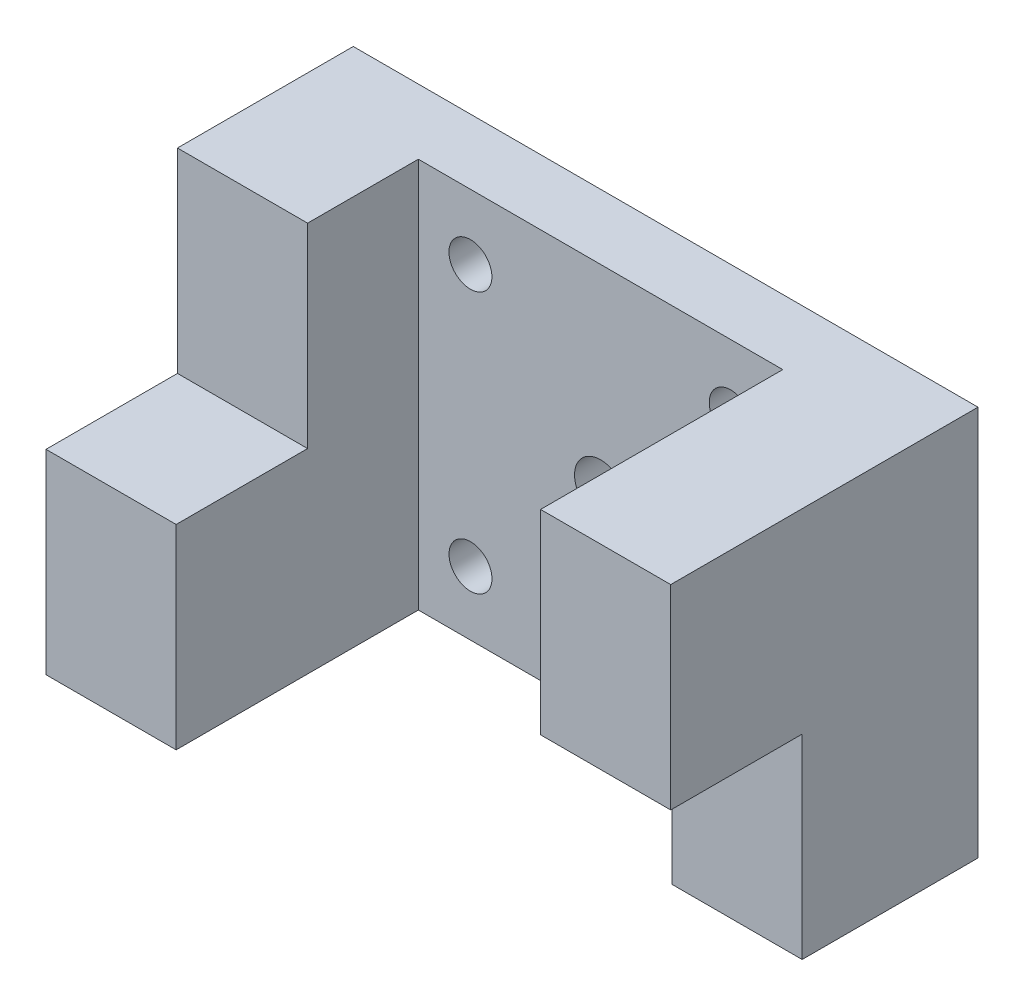
ISO-10303-21;
HEADER;
FILE_DESCRIPTION(('STEP AP214'),'2;1');
FILE_NAME('part.step','',(''),(''),'','','');
FILE_SCHEMA(('AUTOMOTIVE_DESIGN { 1 0 10303 214 1 1 1 1 }'));
ENDSEC;
DATA;
#1=APPLICATION_CONTEXT('core data for automotive mechanical design processes');
#2=APPLICATION_PROTOCOL_DEFINITION('international standard','automotive_design',2000,#1);
#3=PRODUCT_CONTEXT('',#1,'mechanical');
#4=PRODUCT('Part','Part','',(#3));
#5=PRODUCT_RELATED_PRODUCT_CATEGORY('part','',(#4));
#6=PRODUCT_DEFINITION_FORMATION('','',#4);
#7=PRODUCT_DEFINITION_CONTEXT('part definition',#1,'design');
#8=PRODUCT_DEFINITION('design','',#6,#7);
#9=PRODUCT_DEFINITION_SHAPE('','',#8);
#10=(LENGTH_UNIT() NAMED_UNIT(*) SI_UNIT(.MILLI.,.METRE.));
#11=(NAMED_UNIT(*) PLANE_ANGLE_UNIT() SI_UNIT($,.RADIAN.));
#12=(NAMED_UNIT(*) SI_UNIT($,.STERADIAN.) SOLID_ANGLE_UNIT());
#13=UNCERTAINTY_MEASURE_WITH_UNIT(LENGTH_MEASURE(1.E-05),#10,'distance_accuracy_value','');
#14=(GEOMETRIC_REPRESENTATION_CONTEXT(3) GLOBAL_UNCERTAINTY_ASSIGNED_CONTEXT((#13)) GLOBAL_UNIT_ASSIGNED_CONTEXT((#10,
#11,#12)) REPRESENTATION_CONTEXT('',''));
#15=CARTESIAN_POINT('',(0.,0.,0.));
#16=DIRECTION('',(0.,0.,1.));
#17=DIRECTION('',(1.,0.,0.));
#18=AXIS2_PLACEMENT_3D('',#15,#16,#17);
#19=CARTESIAN_POINT('',(0.,0.,5.));
#20=DIRECTION('',(0.,0.,-1.));
#21=DIRECTION('',(-1.,0.,0.));
#22=AXIS2_PLACEMENT_3D('',#19,#20,#21);
#23=PLANE('',#22);
#24=CARTESIAN_POINT('',(-10.,9.99999999999999,5.));
#25=DIRECTION('',(0.,0.,1.));
#26=DIRECTION('',(1.,0.,0.));
#27=AXIS2_PLACEMENT_3D('',#24,#25,#26);
#28=CIRCLE('',#27,1.65);
#29=CARTESIAN_POINT('',(-8.35,9.99999999999999,5.));
#30=VERTEX_POINT('',#29);
#31=EDGE_CURVE('E231',#30,#30,#28,.T.);
#32=ORIENTED_EDGE('',*,*,#31,.F.);
#33=EDGE_LOOP('',(#32));
#34=FACE_BOUND('',#33,.T.);
#35=CARTESIAN_POINT('',(10.,10.,5.));
#36=DIRECTION('',(0.,0.,1.));
#37=DIRECTION('',(1.,0.,0.));
#38=AXIS2_PLACEMENT_3D('',#35,#36,#37);
#39=CIRCLE('',#38,1.65);
#40=CARTESIAN_POINT('',(11.65,10.,5.));
#41=VERTEX_POINT('',#40);
#42=EDGE_CURVE('E223',#41,#41,#39,.T.);
#43=ORIENTED_EDGE('',*,*,#42,.F.);
#44=EDGE_LOOP('',(#43));
#45=FACE_BOUND('',#44,.T.);
#46=CARTESIAN_POINT('',(9.99999999999999,-10.,5.));
#47=DIRECTION('',(0.,0.,1.));
#48=DIRECTION('',(1.,0.,0.));
#49=AXIS2_PLACEMENT_3D('',#46,#47,#48);
#50=CIRCLE('',#49,1.65);
#51=CARTESIAN_POINT('',(11.65,-10.,5.));
#52=VERTEX_POINT('',#51);
#53=EDGE_CURVE('E215',#52,#52,#50,.T.);
#54=ORIENTED_EDGE('',*,*,#53,.F.);
#55=EDGE_LOOP('',(#54));
#56=FACE_BOUND('',#55,.T.);
#57=CARTESIAN_POINT('',(-9.99516544397241,-10.0964504629558,5.));
#58=DIRECTION('',(0.,0.,1.));
#59=DIRECTION('',(1.,0.,0.));
#60=AXIS2_PLACEMENT_3D('',#57,#58,#59);
#61=CIRCLE('',#60,1.65);
#62=CARTESIAN_POINT('',(-8.34516544397241,-10.0964504629558,5.));
#63=VERTEX_POINT('',#62);
#64=EDGE_CURVE('E207',#63,#63,#61,.T.);
#65=ORIENTED_EDGE('',*,*,#64,.F.);
#66=EDGE_LOOP('',(#65));
#67=FACE_BOUND('',#66,.T.);
#68=CARTESIAN_POINT('',(0.,0.,5.));
#69=DIRECTION('',(0.,0.,1.));
#70=DIRECTION('',(1.,0.,0.));
#71=AXIS2_PLACEMENT_3D('',#68,#69,#70);
#72=CIRCLE('',#71,2.);
#73=CARTESIAN_POINT('',(2.,0.,5.));
#74=VERTEX_POINT('',#73);
#75=EDGE_CURVE('E167',#74,#74,#72,.T.);
#76=ORIENTED_EDGE('',*,*,#75,.F.);
#77=EDGE_LOOP('',(#76));
#78=FACE_BOUND('',#77,.T.);
#79=DIRECTION('',(1.,0.,0.));
#80=VECTOR('',#79,1.);
#81=CARTESIAN_POINT('',(-24.,-15.,5.));
#82=LINE('',#81,#80);
#83=CARTESIAN_POINT('',(-14.,-15.,5.));
#84=VERTEX_POINT('',#83);
#85=CARTESIAN_POINT('',(14.,-15.,5.));
#86=VERTEX_POINT('',#85);
#87=EDGE_CURVE('E243',#84,#86,#82,.T.);
#88=ORIENTED_EDGE('',*,*,#87,.T.);
#89=DIRECTION('',(0.,-1.,0.));
#90=VECTOR('',#89,1.);
#91=CARTESIAN_POINT('',(14.,0.,5.));
#92=LINE('',#91,#90);
#93=CARTESIAN_POINT('',(14.,15.,5.));
#94=VERTEX_POINT('',#93);
#95=EDGE_CURVE('E202',#94,#86,#92,.T.);
#96=ORIENTED_EDGE('',*,*,#95,.F.);
#97=DIRECTION('',(-1.,0.,0.));
#98=VECTOR('',#97,1.);
#99=CARTESIAN_POINT('',(-24.,15.,5.));
#100=LINE('',#99,#98);
#101=CARTESIAN_POINT('',(-14.,15.,5.));
#102=VERTEX_POINT('',#101);
#103=EDGE_CURVE('E239',#94,#102,#100,.T.);
#104=ORIENTED_EDGE('',*,*,#103,.T.);
#105=DIRECTION('',(0.,-1.,0.));
#106=VECTOR('',#105,1.);
#107=CARTESIAN_POINT('',(-14.,0.,5.));
#108=LINE('',#107,#106);
#109=EDGE_CURVE('E178',#102,#84,#108,.T.);
#110=ORIENTED_EDGE('',*,*,#109,.T.);
#111=EDGE_LOOP('',(#88,#96,#104,#110));
#112=FACE_BOUND('',#111,.T.);
#113=ADVANCED_FACE('F45',(#34,#45,#56,#67,#78,#112),#23,.F.);
#114=CARTESIAN_POINT('',(0.,0.,0.));
#115=DIRECTION('',(0.,0.,-1.));
#116=DIRECTION('',(-1.,0.,0.));
#117=AXIS2_PLACEMENT_3D('',#114,#115,#116);
#118=PLANE('',#117);
#119=CARTESIAN_POINT('',(-9.99516544397241,-10.0964504629558,0.));
#120=DIRECTION('',(0.,0.,1.));
#121=DIRECTION('',(1.,0.,0.));
#122=AXIS2_PLACEMENT_3D('',#119,#120,#121);
#123=CIRCLE('',#122,1.65);
#124=CARTESIAN_POINT('',(-8.34516544397241,-10.0964504629558,0.));
#125=VERTEX_POINT('',#124);
#126=EDGE_CURVE('E205',#125,#125,#123,.T.);
#127=ORIENTED_EDGE('',*,*,#126,.T.);
#128=EDGE_LOOP('',(#127));
#129=FACE_BOUND('',#128,.T.);
#130=CARTESIAN_POINT('',(10.,10.,0.));
#131=DIRECTION('',(0.,0.,1.));
#132=DIRECTION('',(1.,0.,0.));
#133=AXIS2_PLACEMENT_3D('',#130,#131,#132);
#134=CIRCLE('',#133,1.65);
#135=CARTESIAN_POINT('',(11.65,10.,0.));
#136=VERTEX_POINT('',#135);
#137=EDGE_CURVE('E219',#136,#136,#134,.T.);
#138=ORIENTED_EDGE('',*,*,#137,.T.);
#139=EDGE_LOOP('',(#138));
#140=FACE_BOUND('',#139,.T.);
#141=DIRECTION('',(0.,1.,0.));
#142=VECTOR('',#141,1.);
#143=CARTESIAN_POINT('',(24.,-15.,0.));
#144=LINE('',#143,#142);
#145=CARTESIAN_POINT('',(24.,-15.,0.));
#146=VERTEX_POINT('',#145);
#147=CARTESIAN_POINT('',(24.,15.,0.));
#148=VERTEX_POINT('',#147);
#149=EDGE_CURVE('E235',#146,#148,#144,.T.);
#150=ORIENTED_EDGE('',*,*,#149,.F.);
#151=DIRECTION('',(1.,0.,0.));
#152=VECTOR('',#151,1.);
#153=CARTESIAN_POINT('',(-24.,-15.,0.));
#154=LINE('',#153,#152);
#155=CARTESIAN_POINT('',(-24.,-15.,0.));
#156=VERTEX_POINT('',#155);
#157=EDGE_CURVE('E244',#156,#146,#154,.T.);
#158=ORIENTED_EDGE('',*,*,#157,.F.);
#159=DIRECTION('',(0.,-1.,0.));
#160=VECTOR('',#159,1.);
#161=CARTESIAN_POINT('',(-24.,-15.,0.));
#162=LINE('',#161,#160);
#163=CARTESIAN_POINT('',(-24.,15.,0.));
#164=VERTEX_POINT('',#163);
#165=EDGE_CURVE('E255',#164,#156,#162,.T.);
#166=ORIENTED_EDGE('',*,*,#165,.F.);
#167=DIRECTION('',(-1.,0.,0.));
#168=VECTOR('',#167,1.);
#169=CARTESIAN_POINT('',(-24.,15.,0.));
#170=LINE('',#169,#168);
#171=EDGE_CURVE('E252',#148,#164,#170,.T.);
#172=ORIENTED_EDGE('',*,*,#171,.F.);
#173=EDGE_LOOP('',(#150,#158,#166,#172));
#174=FACE_BOUND('',#173,.T.);
#175=CARTESIAN_POINT('',(-10.,9.99999999999999,0.));
#176=DIRECTION('',(0.,0.,1.));
#177=DIRECTION('',(1.,0.,0.));
#178=AXIS2_PLACEMENT_3D('',#175,#176,#177);
#179=CIRCLE('',#178,1.65);
#180=CARTESIAN_POINT('',(-8.35,9.99999999999999,0.));
#181=VERTEX_POINT('',#180);
#182=EDGE_CURVE('E227',#181,#181,#179,.T.);
#183=ORIENTED_EDGE('',*,*,#182,.T.);
#184=EDGE_LOOP('',(#183));
#185=FACE_BOUND('',#184,.T.);
#186=CARTESIAN_POINT('',(9.99999999999999,-10.,0.));
#187=DIRECTION('',(0.,0.,1.));
#188=DIRECTION('',(1.,0.,0.));
#189=AXIS2_PLACEMENT_3D('',#186,#187,#188);
#190=CIRCLE('',#189,1.65);
#191=CARTESIAN_POINT('',(11.65,-10.,0.));
#192=VERTEX_POINT('',#191);
#193=EDGE_CURVE('E211',#192,#192,#190,.T.);
#194=ORIENTED_EDGE('',*,*,#193,.T.);
#195=EDGE_LOOP('',(#194));
#196=FACE_BOUND('',#195,.T.);
#197=CARTESIAN_POINT('',(0.,0.,0.));
#198=DIRECTION('',(0.,0.,1.));
#199=DIRECTION('',(1.,0.,0.));
#200=AXIS2_PLACEMENT_3D('',#197,#198,#199);
#201=CIRCLE('',#200,2.);
#202=CARTESIAN_POINT('',(2.,0.,0.));
#203=VERTEX_POINT('',#202);
#204=EDGE_CURVE('E161',#203,#203,#201,.T.);
#205=ORIENTED_EDGE('',*,*,#204,.T.);
#206=EDGE_LOOP('',(#205));
#207=FACE_BOUND('',#206,.T.);
#208=ADVANCED_FACE('F276',(#129,#140,#174,#185,#196,#207),#118,.T.);
#209=CARTESIAN_POINT('',(24.,-15.,5.));
#210=DIRECTION('',(-1.,0.,0.));
#211=DIRECTION('',(0.,0.,1.));
#212=AXIS2_PLACEMENT_3D('',#209,#210,#211);
#213=PLANE('',#212);
#214=ORIENTED_EDGE('',*,*,#149,.T.);
#215=DIRECTION('',(0.,0.,-1.));
#216=VECTOR('',#215,1.);
#217=CARTESIAN_POINT('',(24.,15.,5.));
#218=LINE('',#217,#216);
#219=CARTESIAN_POINT('',(24.,15.,23.61));
#220=VERTEX_POINT('',#219);
#221=EDGE_CURVE('E11',#220,#148,#218,.T.);
#222=ORIENTED_EDGE('',*,*,#221,.F.);
#223=DIRECTION('',(0.,1.,0.));
#224=VECTOR('',#223,1.);
#225=CARTESIAN_POINT('',(24.,0.,23.61));
#226=LINE('',#225,#224);
#227=CARTESIAN_POINT('',(24.,0.,23.61));
#228=VERTEX_POINT('',#227);
#229=EDGE_CURVE('E310',#228,#220,#226,.T.);
#230=ORIENTED_EDGE('',*,*,#229,.F.);
#231=DIRECTION('',(0.,0.,-1.));
#232=VECTOR('',#231,1.);
#233=CARTESIAN_POINT('',(24.,0.,23.61));
#234=LINE('',#233,#232);
#235=CARTESIAN_POINT('',(24.,0.,13.51));
#236=VERTEX_POINT('',#235);
#237=EDGE_CURVE('E162',#228,#236,#234,.T.);
#238=ORIENTED_EDGE('',*,*,#237,.T.);
#239=DIRECTION('',(0.,1.,0.));
#240=VECTOR('',#239,1.);
#241=CARTESIAN_POINT('',(24.,0.,13.51));
#242=LINE('',#241,#240);
#243=CARTESIAN_POINT('',(24.,-15.,13.51));
#244=VERTEX_POINT('',#243);
#245=EDGE_CURVE('E69',#244,#236,#242,.T.);
#246=ORIENTED_EDGE('',*,*,#245,.F.);
#247=DIRECTION('',(0.,0.,-1.));
#248=VECTOR('',#247,1.);
#249=CARTESIAN_POINT('',(24.,-15.,5.));
#250=LINE('',#249,#248);
#251=EDGE_CURVE('E248',#244,#146,#250,.T.);
#252=ORIENTED_EDGE('',*,*,#251,.T.);
#253=EDGE_LOOP('',(#214,#222,#230,#238,#246,#252));
#254=FACE_BOUND('',#253,.T.);
#255=ADVANCED_FACE('F47',(#254),#213,.F.);
#256=CARTESIAN_POINT('',(-24.,15.,5.));
#257=DIRECTION('',(0.,-1.,0.));
#258=DIRECTION('',(0.,0.,-1.));
#259=AXIS2_PLACEMENT_3D('',#256,#257,#258);
#260=PLANE('',#259);
#261=ORIENTED_EDGE('',*,*,#171,.T.);
#262=DIRECTION('',(0.,0.,-1.));
#263=VECTOR('',#262,1.);
#264=CARTESIAN_POINT('',(-24.,15.,5.));
#265=LINE('',#264,#263);
#266=CARTESIAN_POINT('',(-24.,15.,13.51));
#267=VERTEX_POINT('',#266);
#268=EDGE_CURVE('E54',#267,#164,#265,.T.);
#269=ORIENTED_EDGE('',*,*,#268,.F.);
#270=DIRECTION('',(-1.,0.,0.));
#271=VECTOR('',#270,1.);
#272=CARTESIAN_POINT('',(0.,15.,13.51));
#273=LINE('',#272,#271);
#274=CARTESIAN_POINT('',(-14.,15.,13.51));
#275=VERTEX_POINT('',#274);
#276=EDGE_CURVE('E297',#275,#267,#273,.T.);
#277=ORIENTED_EDGE('',*,*,#276,.F.);
#278=DIRECTION('',(0.,0.,-1.));
#279=VECTOR('',#278,1.);
#280=CARTESIAN_POINT('',(-14.,15.,13.51));
#281=LINE('',#280,#279);
#282=EDGE_CURVE('E155',#275,#102,#281,.T.);
#283=ORIENTED_EDGE('',*,*,#282,.T.);
#284=ORIENTED_EDGE('',*,*,#103,.F.);
#285=DIRECTION('',(0.,0.,-1.));
#286=VECTOR('',#285,1.);
#287=CARTESIAN_POINT('',(14.,15.,23.61));
#288=LINE('',#287,#286);
#289=CARTESIAN_POINT('',(14.,15.,23.61));
#290=VERTEX_POINT('',#289);
#291=EDGE_CURVE('E169',#290,#94,#288,.T.);
#292=ORIENTED_EDGE('',*,*,#291,.F.);
#293=DIRECTION('',(-1.,0.,0.));
#294=VECTOR('',#293,1.);
#295=CARTESIAN_POINT('',(0.,15.,23.61));
#296=LINE('',#295,#294);
#297=EDGE_CURVE('E314',#220,#290,#296,.T.);
#298=ORIENTED_EDGE('',*,*,#297,.F.);
#299=ORIENTED_EDGE('',*,*,#221,.T.);
#300=EDGE_LOOP('',(#261,#269,#277,#283,#284,#292,#298,#299));
#301=FACE_BOUND('',#300,.T.);
#302=ADVANCED_FACE('F323',(#301),#260,.F.);
#303=CARTESIAN_POINT('',(-24.,-15.,5.));
#304=DIRECTION('',(1.,0.,0.));
#305=DIRECTION('',(0.,0.,-1.));
#306=AXIS2_PLACEMENT_3D('',#303,#304,#305);
#307=PLANE('',#306);
#308=ORIENTED_EDGE('',*,*,#165,.T.);
#309=DIRECTION('',(0.,0.,-1.));
#310=VECTOR('',#309,1.);
#311=CARTESIAN_POINT('',(-24.,-15.,5.));
#312=LINE('',#311,#310);
#313=CARTESIAN_POINT('',(-24.,-15.,23.61));
#314=VERTEX_POINT('',#313);
#315=EDGE_CURVE('E263',#314,#156,#312,.T.);
#316=ORIENTED_EDGE('',*,*,#315,.F.);
#317=DIRECTION('',(0.,-1.,0.));
#318=VECTOR('',#317,1.);
#319=CARTESIAN_POINT('',(-24.,0.,23.61));
#320=LINE('',#319,#318);
#321=CARTESIAN_POINT('',(-24.,0.,23.61));
#322=VERTEX_POINT('',#321);
#323=EDGE_CURVE('E181',#322,#314,#320,.T.);
#324=ORIENTED_EDGE('',*,*,#323,.F.);
#325=DIRECTION('',(0.,0.,-1.));
#326=VECTOR('',#325,1.);
#327=CARTESIAN_POINT('',(-24.,0.,23.61));
#328=LINE('',#327,#326);
#329=CARTESIAN_POINT('',(-24.,0.,13.51));
#330=VERTEX_POINT('',#329);
#331=EDGE_CURVE('E194',#322,#330,#328,.T.);
#332=ORIENTED_EDGE('',*,*,#331,.T.);
#333=DIRECTION('',(0.,-1.,0.));
#334=VECTOR('',#333,1.);
#335=CARTESIAN_POINT('',(-24.,0.,13.51));
#336=LINE('',#335,#334);
#337=EDGE_CURVE('E61',#267,#330,#336,.T.);
#338=ORIENTED_EDGE('',*,*,#337,.F.);
#339=ORIENTED_EDGE('',*,*,#268,.T.);
#340=EDGE_LOOP('',(#308,#316,#324,#332,#338,#339));
#341=FACE_BOUND('',#340,.T.);
#342=ADVANCED_FACE('F270',(#341),#307,.F.);
#343=CARTESIAN_POINT('',(-24.,-15.,5.));
#344=DIRECTION('',(0.,1.,0.));
#345=DIRECTION('',(0.,0.,1.));
#346=AXIS2_PLACEMENT_3D('',#343,#344,#345);
#347=PLANE('',#346);
#348=ORIENTED_EDGE('',*,*,#157,.T.);
#349=ORIENTED_EDGE('',*,*,#251,.F.);
#350=DIRECTION('',(1.,0.,0.));
#351=VECTOR('',#350,1.);
#352=CARTESIAN_POINT('',(0.,-15.,13.51));
#353=LINE('',#352,#351);
#354=CARTESIAN_POINT('',(14.,-15.,13.51));
#355=VERTEX_POINT('',#354);
#356=EDGE_CURVE('E147',#355,#244,#353,.T.);
#357=ORIENTED_EDGE('',*,*,#356,.F.);
#358=DIRECTION('',(0.,0.,-1.));
#359=VECTOR('',#358,1.);
#360=CARTESIAN_POINT('',(14.,-15.,13.51));
#361=LINE('',#360,#359);
#362=EDGE_CURVE('E144',#355,#86,#361,.T.);
#363=ORIENTED_EDGE('',*,*,#362,.T.);
#364=ORIENTED_EDGE('',*,*,#87,.F.);
#365=DIRECTION('',(0.,0.,-1.));
#366=VECTOR('',#365,1.);
#367=CARTESIAN_POINT('',(-14.,-15.,23.61));
#368=LINE('',#367,#366);
#369=CARTESIAN_POINT('',(-14.,-15.,23.61));
#370=VERTEX_POINT('',#369);
#371=EDGE_CURVE('E188',#370,#84,#368,.T.);
#372=ORIENTED_EDGE('',*,*,#371,.F.);
#373=DIRECTION('',(1.,0.,0.));
#374=VECTOR('',#373,1.);
#375=CARTESIAN_POINT('',(0.,-15.,23.61));
#376=LINE('',#375,#374);
#377=EDGE_CURVE('E185',#314,#370,#376,.T.);
#378=ORIENTED_EDGE('',*,*,#377,.F.);
#379=ORIENTED_EDGE('',*,*,#315,.T.);
#380=EDGE_LOOP('',(#348,#349,#357,#363,#364,#372,#378,#379));
#381=FACE_BOUND('',#380,.T.);
#382=ADVANCED_FACE('F279',(#381),#347,.F.);
#383=CARTESIAN_POINT('',(-10.,9.99999999999999,5.));
#384=DIRECTION('',(0.,0.,-1.));
#385=DIRECTION('',(-1.,0.,0.));
#386=AXIS2_PLACEMENT_3D('',#383,#384,#385);
#387=CYLINDRICAL_SURFACE('',#386,1.65);
#388=ORIENTED_EDGE('',*,*,#31,.T.);
#389=EDGE_LOOP('',(#388));
#390=FACE_BOUND('',#389,.T.);
#391=ORIENTED_EDGE('',*,*,#182,.F.);
#392=EDGE_LOOP('',(#391));
#393=FACE_BOUND('',#392,.T.);
#394=ADVANCED_FACE('F360',(#390,#393),#387,.F.);
#395=CARTESIAN_POINT('',(10.,10.,5.));
#396=DIRECTION('',(0.,0.,-1.));
#397=DIRECTION('',(-1.,0.,0.));
#398=AXIS2_PLACEMENT_3D('',#395,#396,#397);
#399=CYLINDRICAL_SURFACE('',#398,1.65);
#400=ORIENTED_EDGE('',*,*,#42,.T.);
#401=EDGE_LOOP('',(#400));
#402=FACE_BOUND('',#401,.T.);
#403=ORIENTED_EDGE('',*,*,#137,.F.);
#404=EDGE_LOOP('',(#403));
#405=FACE_BOUND('',#404,.T.);
#406=ADVANCED_FACE('F511',(#402,#405),#399,.F.);
#407=CARTESIAN_POINT('',(9.99999999999999,-10.,5.));
#408=DIRECTION('',(0.,0.,-1.));
#409=DIRECTION('',(-1.,0.,0.));
#410=AXIS2_PLACEMENT_3D('',#407,#408,#409);
#411=CYLINDRICAL_SURFACE('',#410,1.65);
#412=ORIENTED_EDGE('',*,*,#53,.T.);
#413=EDGE_LOOP('',(#412));
#414=FACE_BOUND('',#413,.T.);
#415=ORIENTED_EDGE('',*,*,#193,.F.);
#416=EDGE_LOOP('',(#415));
#417=FACE_BOUND('',#416,.T.);
#418=ADVANCED_FACE('F520',(#414,#417),#411,.F.);
#419=CARTESIAN_POINT('',(-9.99516544397241,-10.0964504629558,5.));
#420=DIRECTION('',(0.,0.,-1.));
#421=DIRECTION('',(-1.,0.,0.));
#422=AXIS2_PLACEMENT_3D('',#419,#420,#421);
#423=CYLINDRICAL_SURFACE('',#422,1.65);
#424=ORIENTED_EDGE('',*,*,#64,.T.);
#425=EDGE_LOOP('',(#424));
#426=FACE_BOUND('',#425,.T.);
#427=ORIENTED_EDGE('',*,*,#126,.F.);
#428=EDGE_LOOP('',(#427));
#429=FACE_BOUND('',#428,.T.);
#430=ADVANCED_FACE('F529',(#426,#429),#423,.F.);
#431=CARTESIAN_POINT('',(0.,0.,5.));
#432=DIRECTION('',(0.,0.,-1.));
#433=DIRECTION('',(-1.,0.,0.));
#434=AXIS2_PLACEMENT_3D('',#431,#432,#433);
#435=CYLINDRICAL_SURFACE('',#434,2.);
#436=ORIENTED_EDGE('',*,*,#75,.T.);
#437=EDGE_LOOP('',(#436));
#438=FACE_BOUND('',#437,.T.);
#439=ORIENTED_EDGE('',*,*,#204,.F.);
#440=EDGE_LOOP('',(#439));
#441=FACE_BOUND('',#440,.T.);
#442=ADVANCED_FACE('F420',(#438,#441),#435,.F.);
#443=CARTESIAN_POINT('',(-14.,0.,23.61));
#444=DIRECTION('',(1.,0.,0.));
#445=DIRECTION('',(0.,1.,0.));
#446=AXIS2_PLACEMENT_3D('',#443,#444,#445);
#447=PLANE('',#446);
#448=ORIENTED_EDGE('',*,*,#109,.F.);
#449=ORIENTED_EDGE('',*,*,#282,.F.);
#450=DIRECTION('',(0.,-1.,0.));
#451=VECTOR('',#450,1.);
#452=CARTESIAN_POINT('',(-14.,0.,13.51));
#453=LINE('',#452,#451);
#454=CARTESIAN_POINT('',(-14.,0.,13.51));
#455=VERTEX_POINT('',#454);
#456=EDGE_CURVE('E293',#275,#455,#453,.T.);
#457=ORIENTED_EDGE('',*,*,#456,.T.);
#458=DIRECTION('',(0.,0.,-1.));
#459=VECTOR('',#458,1.);
#460=CARTESIAN_POINT('',(-14.,0.,23.61));
#461=LINE('',#460,#459);
#462=CARTESIAN_POINT('',(-14.,0.,23.61));
#463=VERTEX_POINT('',#462);
#464=EDGE_CURVE('E198',#463,#455,#461,.T.);
#465=ORIENTED_EDGE('',*,*,#464,.F.);
#466=DIRECTION('',(0.,-1.,0.));
#467=VECTOR('',#466,1.);
#468=CARTESIAN_POINT('',(-14.,0.,23.61));
#469=LINE('',#468,#467);
#470=EDGE_CURVE('E173',#463,#370,#469,.T.);
#471=ORIENTED_EDGE('',*,*,#470,.T.);
#472=ORIENTED_EDGE('',*,*,#371,.T.);
#473=EDGE_LOOP('',(#448,#449,#457,#465,#471,#472));
#474=FACE_BOUND('',#473,.T.);
#475=ADVANCED_FACE('F328',(#474),#447,.T.);
#476=CARTESIAN_POINT('',(0.,0.,23.61));
#477=DIRECTION('',(0.,-1.,0.));
#478=DIRECTION('',(0.,0.,-1.));
#479=AXIS2_PLACEMENT_3D('',#476,#477,#478);
#480=PLANE('',#479);
#481=ORIENTED_EDGE('',*,*,#464,.T.);
#482=DIRECTION('',(-1.,0.,0.));
#483=VECTOR('',#482,1.);
#484=CARTESIAN_POINT('',(0.,0.,13.51));
#485=LINE('',#484,#483);
#486=EDGE_CURVE('E290',#455,#330,#485,.T.);
#487=ORIENTED_EDGE('',*,*,#486,.T.);
#488=ORIENTED_EDGE('',*,*,#331,.F.);
#489=DIRECTION('',(-1.,0.,0.));
#490=VECTOR('',#489,1.);
#491=CARTESIAN_POINT('',(0.,0.,23.61));
#492=LINE('',#491,#490);
#493=EDGE_CURVE('E177',#463,#322,#492,.T.);
#494=ORIENTED_EDGE('',*,*,#493,.F.);
#495=EDGE_LOOP('',(#481,#487,#488,#494));
#496=FACE_BOUND('',#495,.T.);
#497=ADVANCED_FACE('F336',(#496),#480,.F.);
#498=CARTESIAN_POINT('',(0.,0.,23.61));
#499=DIRECTION('',(0.,0.,1.));
#500=DIRECTION('',(1.,0.,0.));
#501=AXIS2_PLACEMENT_3D('',#498,#499,#500);
#502=PLANE('',#501);
#503=ORIENTED_EDGE('',*,*,#470,.F.);
#504=ORIENTED_EDGE('',*,*,#493,.T.);
#505=ORIENTED_EDGE('',*,*,#323,.T.);
#506=ORIENTED_EDGE('',*,*,#377,.T.);
#507=EDGE_LOOP('',(#503,#504,#505,#506));
#508=FACE_BOUND('',#507,.T.);
#509=ADVANCED_FACE('F332',(#508),#502,.T.);
#510=CARTESIAN_POINT('',(14.,0.,23.61));
#511=DIRECTION('',(1.,0.,0.));
#512=DIRECTION('',(0.,1.,0.));
#513=AXIS2_PLACEMENT_3D('',#510,#511,#512);
#514=PLANE('',#513);
#515=ORIENTED_EDGE('',*,*,#95,.T.);
#516=ORIENTED_EDGE('',*,*,#362,.F.);
#517=DIRECTION('',(0.,-1.,0.));
#518=VECTOR('',#517,1.);
#519=CARTESIAN_POINT('',(14.,0.,13.51));
#520=LINE('',#519,#518);
#521=CARTESIAN_POINT('',(14.,0.,13.51));
#522=VERTEX_POINT('',#521);
#523=EDGE_CURVE('E138',#522,#355,#520,.T.);
#524=ORIENTED_EDGE('',*,*,#523,.F.);
#525=DIRECTION('',(0.,0.,-1.));
#526=VECTOR('',#525,1.);
#527=CARTESIAN_POINT('',(14.,0.,23.61));
#528=LINE('',#527,#526);
#529=CARTESIAN_POINT('',(14.,0.,23.61));
#530=VERTEX_POINT('',#529);
#531=EDGE_CURVE('E142',#530,#522,#528,.T.);
#532=ORIENTED_EDGE('',*,*,#531,.F.);
#533=DIRECTION('',(0.,-1.,0.));
#534=VECTOR('',#533,1.);
#535=CARTESIAN_POINT('',(14.,0.,23.61));
#536=LINE('',#535,#534);
#537=EDGE_CURVE('E305',#290,#530,#536,.T.);
#538=ORIENTED_EDGE('',*,*,#537,.F.);
#539=ORIENTED_EDGE('',*,*,#291,.T.);
#540=EDGE_LOOP('',(#515,#516,#524,#532,#538,#539));
#541=FACE_BOUND('',#540,.T.);
#542=ADVANCED_FACE('F139',(#541),#514,.F.);
#543=CARTESIAN_POINT('',(0.,0.,23.61));
#544=DIRECTION('',(0.,1.,0.));
#545=DIRECTION('',(-1.,0.,0.));
#546=AXIS2_PLACEMENT_3D('',#543,#544,#545);
#547=PLANE('',#546);
#548=ORIENTED_EDGE('',*,*,#531,.T.);
#549=DIRECTION('',(1.,0.,0.));
#550=VECTOR('',#549,1.);
#551=CARTESIAN_POINT('',(0.,0.,13.51));
#552=LINE('',#551,#550);
#553=EDGE_CURVE('E148',#522,#236,#552,.T.);
#554=ORIENTED_EDGE('',*,*,#553,.T.);
#555=ORIENTED_EDGE('',*,*,#237,.F.);
#556=DIRECTION('',(1.,0.,0.));
#557=VECTOR('',#556,1.);
#558=CARTESIAN_POINT('',(0.,0.,23.61));
#559=LINE('',#558,#557);
#560=EDGE_CURVE('E158',#530,#228,#559,.T.);
#561=ORIENTED_EDGE('',*,*,#560,.F.);
#562=EDGE_LOOP('',(#548,#554,#555,#561));
#563=FACE_BOUND('',#562,.T.);
#564=ADVANCED_FACE('F157',(#563),#547,.F.);
#565=CARTESIAN_POINT('',(0.,0.,23.61));
#566=DIRECTION('',(0.,0.,1.));
#567=DIRECTION('',(1.,0.,0.));
#568=AXIS2_PLACEMENT_3D('',#565,#566,#567);
#569=PLANE('',#568);
#570=ORIENTED_EDGE('',*,*,#537,.T.);
#571=ORIENTED_EDGE('',*,*,#560,.T.);
#572=ORIENTED_EDGE('',*,*,#229,.T.);
#573=ORIENTED_EDGE('',*,*,#297,.T.);
#574=EDGE_LOOP('',(#570,#571,#572,#573));
#575=FACE_BOUND('',#574,.T.);
#576=ADVANCED_FACE('F344',(#575),#569,.T.);
#577=CARTESIAN_POINT('',(0.,0.,13.51));
#578=DIRECTION('',(0.,0.,1.));
#579=DIRECTION('',(1.,0.,0.));
#580=AXIS2_PLACEMENT_3D('',#577,#578,#579);
#581=PLANE('',#580);
#582=ORIENTED_EDGE('',*,*,#553,.F.);
#583=ORIENTED_EDGE('',*,*,#523,.T.);
#584=ORIENTED_EDGE('',*,*,#356,.T.);
#585=ORIENTED_EDGE('',*,*,#245,.T.);
#586=EDGE_LOOP('',(#582,#583,#584,#585));
#587=FACE_BOUND('',#586,.T.);
#588=ADVANCED_FACE('F150',(#587),#581,.T.);
#589=CARTESIAN_POINT('',(0.,0.,13.51));
#590=DIRECTION('',(0.,0.,1.));
#591=DIRECTION('',(1.,0.,0.));
#592=AXIS2_PLACEMENT_3D('',#589,#590,#591);
#593=PLANE('',#592);
#594=ORIENTED_EDGE('',*,*,#486,.F.);
#595=ORIENTED_EDGE('',*,*,#456,.F.);
#596=ORIENTED_EDGE('',*,*,#276,.T.);
#597=ORIENTED_EDGE('',*,*,#337,.T.);
#598=EDGE_LOOP('',(#594,#595,#596,#597));
#599=FACE_BOUND('',#598,.T.);
#600=ADVANCED_FACE('F338',(#599),#593,.T.);
#601=CLOSED_SHELL('',(#113,#208,#255,#302,#342,#382,#394,#406,#418,#430,#442,#475,#497,#509,
#542,#564,#576,#588,#600));
#602=MANIFOLD_SOLID_BREP('B2',#601);
#603=ADVANCED_BREP_SHAPE_REPRESENTATION('',(#18,#602),#14);
#604=SHAPE_DEFINITION_REPRESENTATION(#9,#603);
ENDSEC;
END-ISO-10303-21;
